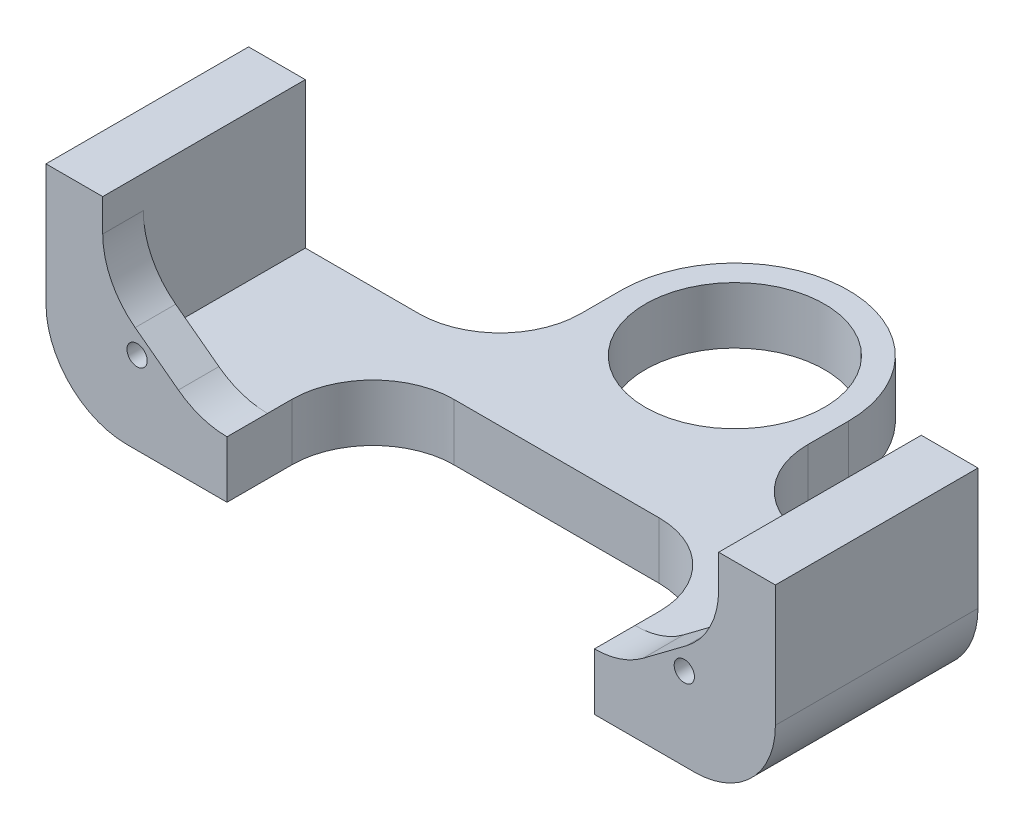
ISO-10303-21;
HEADER;
FILE_DESCRIPTION(('STEP AP214'),'2;1');
FILE_NAME('part.step','',(''),(''),'','','');
FILE_SCHEMA(('AUTOMOTIVE_DESIGN { 1 0 10303 214 1 1 1 1 }'));
ENDSEC;
DATA;
#1=APPLICATION_CONTEXT('core data for automotive mechanical design processes');
#2=APPLICATION_PROTOCOL_DEFINITION('international standard','automotive_design',2000,#1);
#3=PRODUCT_CONTEXT('',#1,'mechanical');
#4=PRODUCT('Part','Part','',(#3));
#5=PRODUCT_RELATED_PRODUCT_CATEGORY('part','',(#4));
#6=PRODUCT_DEFINITION_FORMATION('','',#4);
#7=PRODUCT_DEFINITION_CONTEXT('part definition',#1,'design');
#8=PRODUCT_DEFINITION('design','',#6,#7);
#9=PRODUCT_DEFINITION_SHAPE('','',#8);
#10=(LENGTH_UNIT() NAMED_UNIT(*) SI_UNIT(.MILLI.,.METRE.));
#11=(NAMED_UNIT(*) PLANE_ANGLE_UNIT() SI_UNIT($,.RADIAN.));
#12=(NAMED_UNIT(*) SI_UNIT($,.STERADIAN.) SOLID_ANGLE_UNIT());
#13=UNCERTAINTY_MEASURE_WITH_UNIT(LENGTH_MEASURE(1.E-05),#10,'distance_accuracy_value','');
#14=(GEOMETRIC_REPRESENTATION_CONTEXT(3) GLOBAL_UNCERTAINTY_ASSIGNED_CONTEXT((#13)) GLOBAL_UNIT_ASSIGNED_CONTEXT((#10,
#11,#12)) REPRESENTATION_CONTEXT('',''));
#15=CARTESIAN_POINT('',(0.,0.,0.));
#16=DIRECTION('',(0.,0.,1.));
#17=DIRECTION('',(1.,0.,0.));
#18=AXIS2_PLACEMENT_3D('',#15,#16,#17);
#19=CARTESIAN_POINT('',(0.,7.,40.));
#20=DIRECTION('',(0.,0.,-1.));
#21=DIRECTION('',(-1.,0.,0.));
#22=AXIS2_PLACEMENT_3D('',#19,#20,#21);
#23=PLANE('',#22);
#24=CARTESIAN_POINT('',(-19.76,10.18,40.));
#25=DIRECTION('',(0.,0.,-1.));
#26=DIRECTION('',(-1.,0.,0.));
#27=AXIS2_PLACEMENT_3D('',#24,#25,#26);
#28=CIRCLE('',#27,1.25);
#29=CARTESIAN_POINT('',(-21.01,10.18,40.));
#30=VERTEX_POINT('',#29);
#31=EDGE_CURVE('E357',#30,#30,#28,.T.);
#32=ORIENTED_EDGE('',*,*,#31,.T.);
#33=EDGE_LOOP('',(#32));
#34=FACE_BOUND('',#33,.T.);
#35=DIRECTION('',(1.,0.,0.));
#36=VECTOR('',#35,1.);
#37=CARTESIAN_POINT('',(0.,0.,40.));
#38=LINE('',#37,#36);
#39=CARTESIAN_POINT('',(-21.,0.,40.));
#40=VERTEX_POINT('',#39);
#41=CARTESIAN_POINT('',(-8.66666666666666,0.,40.));
#42=VERTEX_POINT('',#41);
#43=EDGE_CURVE('E252',#40,#42,#38,.T.);
#44=ORIENTED_EDGE('',*,*,#43,.T.);
#45=DIRECTION('',(0.,1.,0.));
#46=VECTOR('',#45,1.);
#47=CARTESIAN_POINT('',(-8.66666666666666,-48.7761325969076,40.));
#48=LINE('',#47,#46);
#49=CARTESIAN_POINT('',(-8.66666666666666,7.,40.));
#50=VERTEX_POINT('',#49);
#51=EDGE_CURVE('E235',#42,#50,#48,.T.);
#52=ORIENTED_EDGE('',*,*,#51,.T.);
#53=CARTESIAN_POINT('',(-8.66666666666666,17.,40.));
#54=DIRECTION('',(0.,0.,-1.));
#55=DIRECTION('',(-1.,0.,0.));
#56=AXIS2_PLACEMENT_3D('',#53,#54,#55);
#57=CIRCLE('',#56,10.);
#58=CARTESIAN_POINT('',(-14.6666666666667,9.,40.));
#59=VERTEX_POINT('',#58);
#60=EDGE_CURVE('E249',#50,#59,#57,.T.);
#61=ORIENTED_EDGE('',*,*,#60,.T.);
#62=DIRECTION('',(0.8,-0.6,0.));
#63=VECTOR('',#62,1.);
#64=CARTESIAN_POINT('',(16.96,-14.72,40.));
#65=LINE('',#64,#63);
#66=CARTESIAN_POINT('',(-20.,13.,40.));
#67=VERTEX_POINT('',#66);
#68=EDGE_CURVE('E363',#67,#59,#65,.T.);
#69=ORIENTED_EDGE('',*,*,#68,.F.);
#70=CARTESIAN_POINT('',(-14.,21.,40.));
#71=DIRECTION('',(0.,0.,-1.));
#72=DIRECTION('',(-1.,0.,0.));
#73=AXIS2_PLACEMENT_3D('',#70,#71,#72);
#74=CIRCLE('',#73,10.);
#75=CARTESIAN_POINT('',(-24.,21.,40.));
#76=VERTEX_POINT('',#75);
#77=EDGE_CURVE('E560',#67,#76,#74,.T.);
#78=ORIENTED_EDGE('',*,*,#77,.T.);
#79=DIRECTION('',(0.,1.,0.));
#80=VECTOR('',#79,1.);
#81=CARTESIAN_POINT('',(-24.,0.,40.));
#82=LINE('',#81,#80);
#83=CARTESIAN_POINT('',(-24.,25.,40.));
#84=VERTEX_POINT('',#83);
#85=EDGE_CURVE('E371',#76,#84,#82,.T.);
#86=ORIENTED_EDGE('',*,*,#85,.T.);
#87=DIRECTION('',(1.,0.,0.));
#88=VECTOR('',#87,1.);
#89=CARTESIAN_POINT('',(28.,25.,40.));
#90=LINE('',#89,#88);
#91=CARTESIAN_POINT('',(-31.,25.,40.));
#92=VERTEX_POINT('',#91);
#93=EDGE_CURVE('E374',#92,#84,#90,.T.);
#94=ORIENTED_EDGE('',*,*,#93,.F.);
#95=DIRECTION('',(0.,1.,0.));
#96=VECTOR('',#95,1.);
#97=CARTESIAN_POINT('',(-31.,0.,40.));
#98=LINE('',#97,#96);
#99=CARTESIAN_POINT('',(-31.,10.,40.));
#100=VERTEX_POINT('',#99);
#101=EDGE_CURVE('E378',#100,#92,#98,.T.);
#102=ORIENTED_EDGE('',*,*,#101,.F.);
#103=CARTESIAN_POINT('',(-21.,10.,40.));
#104=DIRECTION('',(0.,0.,-1.));
#105=DIRECTION('',(-1.,0.,0.));
#106=AXIS2_PLACEMENT_3D('',#103,#104,#105);
#107=CIRCLE('',#106,10.);
#108=EDGE_CURVE('E527',#100,#40,#107,.F.);
#109=ORIENTED_EDGE('',*,*,#108,.T.);
#110=EDGE_LOOP('',(#44,#52,#61,#69,#78,#86,#94,#102,#109));
#111=FACE_BOUND('',#110,.T.);
#112=ADVANCED_FACE('F41',(#34,#111),#23,.F.);
#113=CARTESIAN_POINT('',(0.,7.,0.));
#114=DIRECTION('',(1.,0.,0.));
#115=DIRECTION('',(0.,0.,-1.));
#116=AXIS2_PLACEMENT_3D('',#113,#114,#115);
#117=PLANE('',#116);
#118=DIRECTION('',(0.,0.,1.));
#119=VECTOR('',#118,1.);
#120=CARTESIAN_POINT('',(0.,0.,0.));
#121=LINE('',#120,#119);
#122=CARTESIAN_POINT('',(0.,0.,0.));
#123=VERTEX_POINT('',#122);
#124=CARTESIAN_POINT('',(0.,0.,5.00000000000002));
#125=VERTEX_POINT('',#124);
#126=EDGE_CURVE('E475',#123,#125,#121,.T.);
#127=ORIENTED_EDGE('',*,*,#126,.T.);
#128=DIRECTION('',(0.,1.,0.));
#129=VECTOR('',#128,1.);
#130=CARTESIAN_POINT('',(0.,7.,5.00000000000002));
#131=LINE('',#130,#129);
#132=CARTESIAN_POINT('',(0.,7.,5.00000000000002));
#133=VERTEX_POINT('',#132);
#134=EDGE_CURVE('E556',#125,#133,#131,.T.);
#135=ORIENTED_EDGE('',*,*,#134,.T.);
#136=DIRECTION('',(0.,0.,1.));
#137=VECTOR('',#136,1.);
#138=CARTESIAN_POINT('',(0.,7.,0.));
#139=LINE('',#138,#137);
#140=CARTESIAN_POINT('',(0.,7.,0.));
#141=VERTEX_POINT('',#140);
#142=EDGE_CURVE('E463',#141,#133,#139,.T.);
#143=ORIENTED_EDGE('',*,*,#142,.F.);
#144=DIRECTION('',(0.,-1.,0.));
#145=VECTOR('',#144,1.);
#146=CARTESIAN_POINT('',(0.,7.,0.));
#147=LINE('',#146,#145);
#148=EDGE_CURVE('E487',#141,#123,#147,.T.);
#149=ORIENTED_EDGE('',*,*,#148,.T.);
#150=EDGE_LOOP('',(#127,#135,#143,#149));
#151=FACE_BOUND('',#150,.T.);
#152=ADVANCED_FACE('F623',(#151),#117,.F.);
#153=CARTESIAN_POINT('',(0.,0.,35.));
#154=DIRECTION('',(0.,0.,1.));
#155=DIRECTION('',(1.,0.,0.));
#156=AXIS2_PLACEMENT_3D('',#153,#154,#155);
#157=PLANE('',#156);
#158=CARTESIAN_POINT('',(47.76,10.18,35.));
#159=DIRECTION('',(0.,0.,1.));
#160=DIRECTION('',(1.,0.,0.));
#161=AXIS2_PLACEMENT_3D('',#158,#159,#160);
#162=CIRCLE('',#161,1.25);
#163=CARTESIAN_POINT('',(49.01,10.18,35.));
#164=VERTEX_POINT('',#163);
#165=EDGE_CURVE('E417',#164,#164,#162,.T.);
#166=ORIENTED_EDGE('',*,*,#165,.T.);
#167=EDGE_LOOP('',(#166));
#168=FACE_BOUND('',#167,.T.);
#169=DIRECTION('',(1.,0.,0.));
#170=VECTOR('',#169,1.);
#171=CARTESIAN_POINT('',(0.,6.99999999999999,35.));
#172=LINE('',#171,#170);
#173=CARTESIAN_POINT('',(36.6666666666667,7.,35.));
#174=VERTEX_POINT('',#173);
#175=CARTESIAN_POINT('',(52.,6.99999999999999,35.));
#176=VERTEX_POINT('',#175);
#177=EDGE_CURVE('E491',#174,#176,#172,.T.);
#178=ORIENTED_EDGE('',*,*,#177,.F.);
#179=CARTESIAN_POINT('',(36.6666666666667,17.,35.));
#180=DIRECTION('',(0.,0.,1.));
#181=DIRECTION('',(1.,0.,0.));
#182=AXIS2_PLACEMENT_3D('',#179,#180,#181);
#183=CIRCLE('',#182,10.);
#184=CARTESIAN_POINT('',(42.6666666666667,9.,35.));
#185=VERTEX_POINT('',#184);
#186=EDGE_CURVE('E262',#174,#185,#183,.T.);
#187=ORIENTED_EDGE('',*,*,#186,.T.);
#188=DIRECTION('',(-0.8,-0.6,0.));
#189=VECTOR('',#188,1.);
#190=CARTESIAN_POINT('',(11.04,-14.72,35.));
#191=LINE('',#190,#189);
#192=CARTESIAN_POINT('',(48.,13.,35.));
#193=VERTEX_POINT('',#192);
#194=EDGE_CURVE('E421',#193,#185,#191,.T.);
#195=ORIENTED_EDGE('',*,*,#194,.F.);
#196=CARTESIAN_POINT('',(42.,21.,35.));
#197=DIRECTION('',(0.,0.,1.));
#198=DIRECTION('',(1.,0.,0.));
#199=AXIS2_PLACEMENT_3D('',#196,#197,#198);
#200=CIRCLE('',#199,10.);
#201=CARTESIAN_POINT('',(52.,21.,35.));
#202=VERTEX_POINT('',#201);
#203=EDGE_CURVE('E569',#193,#202,#200,.T.);
#204=ORIENTED_EDGE('',*,*,#203,.T.);
#205=DIRECTION('',(0.,1.,0.));
#206=VECTOR('',#205,1.);
#207=CARTESIAN_POINT('',(52.,16.,35.));
#208=LINE('',#207,#206);
#209=EDGE_CURVE('E387',#176,#202,#208,.T.);
#210=ORIENTED_EDGE('',*,*,#209,.F.);
#211=EDGE_LOOP('',(#178,#187,#195,#204,#210));
#212=FACE_BOUND('',#211,.T.);
#213=ADVANCED_FACE('F592',(#168,#212),#157,.F.);
#214=CARTESIAN_POINT('',(28.,7.,0.));
#215=DIRECTION('',(-1.,0.,0.));
#216=DIRECTION('',(0.,0.,1.));
#217=AXIS2_PLACEMENT_3D('',#214,#215,#216);
#218=PLANE('',#217);
#219=DIRECTION('',(0.,0.,-1.));
#220=VECTOR('',#219,1.);
#221=CARTESIAN_POINT('',(28.,7.,0.));
#222=LINE('',#221,#220);
#223=CARTESIAN_POINT('',(28.,7.,5.));
#224=VERTEX_POINT('',#223);
#225=CARTESIAN_POINT('',(28.,7.,0.));
#226=VERTEX_POINT('',#225);
#227=EDGE_CURVE('E468',#224,#226,#222,.T.);
#228=ORIENTED_EDGE('',*,*,#227,.F.);
#229=DIRECTION('',(0.,1.,0.));
#230=VECTOR('',#229,1.);
#231=CARTESIAN_POINT('',(28.,7.,5.));
#232=LINE('',#231,#230);
#233=CARTESIAN_POINT('',(28.,0.,5.));
#234=VERTEX_POINT('',#233);
#235=EDGE_CURVE('E553',#224,#234,#232,.F.);
#236=ORIENTED_EDGE('',*,*,#235,.T.);
#237=DIRECTION('',(0.,0.,-1.));
#238=VECTOR('',#237,1.);
#239=CARTESIAN_POINT('',(28.,0.,0.));
#240=LINE('',#239,#238);
#241=CARTESIAN_POINT('',(28.,0.,0.));
#242=VERTEX_POINT('',#241);
#243=EDGE_CURVE('E464',#234,#242,#240,.T.);
#244=ORIENTED_EDGE('',*,*,#243,.T.);
#245=DIRECTION('',(0.,-1.,0.));
#246=VECTOR('',#245,1.);
#247=CARTESIAN_POINT('',(28.,7.,0.));
#248=LINE('',#247,#246);
#249=EDGE_CURVE('E471',#226,#242,#248,.T.);
#250=ORIENTED_EDGE('',*,*,#249,.F.);
#251=EDGE_LOOP('',(#228,#236,#244,#250));
#252=FACE_BOUND('',#251,.T.);
#253=ADVANCED_FACE('F612',(#252),#218,.F.);
#254=CARTESIAN_POINT('',(14.,7.,0.));
#255=DIRECTION('',(0.,1.,0.));
#256=DIRECTION('',(0.,0.,1.));
#257=AXIS2_PLACEMENT_3D('',#254,#255,#256);
#258=PLANE('',#257);
#259=DIRECTION('',(0.,0.,1.));
#260=VECTOR('',#259,1.);
#261=CARTESIAN_POINT('',(-8.66666666666666,7.,22.));
#262=LINE('',#261,#260);
#263=CARTESIAN_POINT('',(-8.66666666666666,7.,32.));
#264=VERTEX_POINT('',#263);
#265=CARTESIAN_POINT('',(-8.66666666666666,7.,35.));
#266=VERTEX_POINT('',#265);
#267=EDGE_CURVE('E237',#264,#266,#262,.T.);
#268=ORIENTED_EDGE('',*,*,#267,.F.);
#269=CARTESIAN_POINT('',(1.33333333333334,7.,32.));
#270=DIRECTION('',(0.,1.,0.));
#271=DIRECTION('',(0.,0.,1.));
#272=AXIS2_PLACEMENT_3D('',#269,#270,#271);
#273=CIRCLE('',#272,10.);
#274=CARTESIAN_POINT('',(1.33333333333334,7.,22.));
#275=VERTEX_POINT('',#274);
#276=EDGE_CURVE('E50',#264,#275,#273,.F.);
#277=ORIENTED_EDGE('',*,*,#276,.T.);
#278=DIRECTION('',(-1.,0.,0.));
#279=VECTOR('',#278,1.);
#280=CARTESIAN_POINT('',(-8.66666666666666,7.,22.));
#281=LINE('',#280,#279);
#282=CARTESIAN_POINT('',(26.6666666666667,7.,22.));
#283=VERTEX_POINT('',#282);
#284=EDGE_CURVE('E255',#283,#275,#281,.T.);
#285=ORIENTED_EDGE('',*,*,#284,.F.);
#286=CARTESIAN_POINT('',(26.6666666666667,7.,32.));
#287=DIRECTION('',(0.,1.,0.));
#288=DIRECTION('',(0.,0.,1.));
#289=AXIS2_PLACEMENT_3D('',#286,#287,#288);
#290=CIRCLE('',#289,10.);
#291=CARTESIAN_POINT('',(36.6666666666667,7.,32.));
#292=VERTEX_POINT('',#291);
#293=EDGE_CURVE('E297',#283,#292,#290,.F.);
#294=ORIENTED_EDGE('',*,*,#293,.T.);
#295=DIRECTION('',(0.,0.,-1.));
#296=VECTOR('',#295,1.);
#297=CARTESIAN_POINT('',(36.6666666666667,7.,22.));
#298=LINE('',#297,#296);
#299=EDGE_CURVE('E313',#174,#292,#298,.T.);
#300=ORIENTED_EDGE('',*,*,#299,.F.);
#301=ORIENTED_EDGE('',*,*,#177,.T.);
#302=DIRECTION('',(0.,0.,1.));
#303=VECTOR('',#302,1.);
#304=CARTESIAN_POINT('',(52.,6.99999999999999,15.));
#305=LINE('',#304,#303);
#306=CARTESIAN_POINT('',(52.,6.99999999999999,15.));
#307=VERTEX_POINT('',#306);
#308=EDGE_CURVE('E410',#307,#176,#305,.T.);
#309=ORIENTED_EDGE('',*,*,#308,.F.);
#310=DIRECTION('',(1.,0.,0.));
#311=VECTOR('',#310,1.);
#312=CARTESIAN_POINT('',(28.,7.,15.));
#313=LINE('',#312,#311);
#314=CARTESIAN_POINT('',(38.,6.99999999999999,15.));
#315=VERTEX_POINT('',#314);
#316=EDGE_CURVE('E407',#315,#307,#313,.T.);
#317=ORIENTED_EDGE('',*,*,#316,.F.);
#318=CARTESIAN_POINT('',(38.,7.,5.));
#319=DIRECTION('',(0.,1.,0.));
#320=DIRECTION('',(0.,0.,1.));
#321=AXIS2_PLACEMENT_3D('',#318,#319,#320);
#322=CIRCLE('',#321,10.);
#323=EDGE_CURVE('E267',#315,#224,#322,.F.);
#324=ORIENTED_EDGE('',*,*,#323,.T.);
#325=ORIENTED_EDGE('',*,*,#227,.T.);
#326=CARTESIAN_POINT('',(14.,7.,0.));
#327=DIRECTION('',(0.,1.,0.));
#328=DIRECTION('',(0.,0.,1.));
#329=AXIS2_PLACEMENT_3D('',#326,#327,#328);
#330=CIRCLE('',#329,14.);
#331=EDGE_CURVE('E459',#226,#141,#330,.T.);
#332=ORIENTED_EDGE('',*,*,#331,.T.);
#333=ORIENTED_EDGE('',*,*,#142,.T.);
#334=CARTESIAN_POINT('',(-10.,7.,5.00000000000002));
#335=DIRECTION('',(0.,1.,0.));
#336=DIRECTION('',(0.,0.,1.));
#337=AXIS2_PLACEMENT_3D('',#334,#335,#336);
#338=CIRCLE('',#337,10.);
#339=CARTESIAN_POINT('',(-9.99999999999999,6.99999999999999,15.));
#340=VERTEX_POINT('',#339);
#341=EDGE_CURVE('E278',#133,#340,#338,.F.);
#342=ORIENTED_EDGE('',*,*,#341,.T.);
#343=DIRECTION('',(-1.,0.,0.));
#344=VECTOR('',#343,1.);
#345=CARTESIAN_POINT('',(-24.,6.99999999999999,15.));
#346=LINE('',#345,#344);
#347=CARTESIAN_POINT('',(-24.,6.99999999999999,15.));
#348=VERTEX_POINT('',#347);
#349=EDGE_CURVE('E338',#340,#348,#346,.T.);
#350=ORIENTED_EDGE('',*,*,#349,.T.);
#351=DIRECTION('',(0.,0.,1.));
#352=VECTOR('',#351,1.);
#353=CARTESIAN_POINT('',(-24.,6.99999999999999,15.));
#354=LINE('',#353,#352);
#355=CARTESIAN_POINT('',(-24.,6.99999999999999,35.));
#356=VERTEX_POINT('',#355);
#357=EDGE_CURVE('E352',#348,#356,#354,.T.);
#358=ORIENTED_EDGE('',*,*,#357,.T.);
#359=DIRECTION('',(-1.,0.,0.));
#360=VECTOR('',#359,1.);
#361=CARTESIAN_POINT('',(28.,7.00000000000001,35.));
#362=LINE('',#361,#360);
#363=EDGE_CURVE('E495',#266,#356,#362,.T.);
#364=ORIENTED_EDGE('',*,*,#363,.F.);
#365=EDGE_LOOP('',(#268,#277,#285,#294,#300,#301,#309,#317,#324,#325,#332,#333,#342,#350,#358,#364));
#366=FACE_BOUND('',#365,.T.);
#367=CARTESIAN_POINT('',(14.,7.,0.));
#368=DIRECTION('',(0.,1.,0.));
#369=DIRECTION('',(0.,0.,1.));
#370=AXIS2_PLACEMENT_3D('',#367,#368,#369);
#371=CIRCLE('',#370,11.05);
#372=CARTESIAN_POINT('',(14.,7.,11.05));
#373=VERTEX_POINT('',#372);
#374=EDGE_CURVE('E451',#373,#373,#371,.T.);
#375=ORIENTED_EDGE('',*,*,#374,.F.);
#376=EDGE_LOOP('',(#375));
#377=FACE_BOUND('',#376,.T.);
#378=ADVANCED_FACE('F306',(#366,#377),#258,.T.);
#379=CARTESIAN_POINT('',(14.,0.,0.));
#380=DIRECTION('',(0.,1.,0.));
#381=DIRECTION('',(0.,0.,1.));
#382=AXIS2_PLACEMENT_3D('',#379,#380,#381);
#383=PLANE('',#382);
#384=DIRECTION('',(1.,0.,0.));
#385=VECTOR('',#384,1.);
#386=CARTESIAN_POINT('',(-8.66666666666666,0.,22.));
#387=LINE('',#386,#385);
#388=CARTESIAN_POINT('',(1.33333333333334,0.,22.));
#389=VERTEX_POINT('',#388);
#390=CARTESIAN_POINT('',(26.6666666666667,0.,22.));
#391=VERTEX_POINT('',#390);
#392=EDGE_CURVE('E318',#389,#391,#387,.T.);
#393=ORIENTED_EDGE('',*,*,#392,.F.);
#394=CARTESIAN_POINT('',(1.33333333333334,0.,32.));
#395=DIRECTION('',(0.,1.,0.));
#396=DIRECTION('',(0.,0.,1.));
#397=AXIS2_PLACEMENT_3D('',#394,#395,#396);
#398=CIRCLE('',#397,10.);
#399=CARTESIAN_POINT('',(-8.66666666666666,0.,32.));
#400=VERTEX_POINT('',#399);
#401=EDGE_CURVE('E11',#389,#400,#398,.T.);
#402=ORIENTED_EDGE('',*,*,#401,.T.);
#403=DIRECTION('',(0.,0.,-1.));
#404=VECTOR('',#403,1.);
#405=CARTESIAN_POINT('',(-8.66666666666666,0.,22.));
#406=LINE('',#405,#404);
#407=EDGE_CURVE('E315',#42,#400,#406,.T.);
#408=ORIENTED_EDGE('',*,*,#407,.F.);
#409=ORIENTED_EDGE('',*,*,#43,.F.);
#410=DIRECTION('',(0.,0.,1.));
#411=VECTOR('',#410,1.);
#412=CARTESIAN_POINT('',(-21.,0.,0.));
#413=LINE('',#412,#411);
#414=CARTESIAN_POINT('',(-21.,0.,15.));
#415=VERTEX_POINT('',#414);
#416=EDGE_CURVE('E534',#40,#415,#413,.F.);
#417=ORIENTED_EDGE('',*,*,#416,.T.);
#418=DIRECTION('',(1.,0.,0.));
#419=VECTOR('',#418,1.);
#420=CARTESIAN_POINT('',(-31.,0.,15.));
#421=LINE('',#420,#419);
#422=CARTESIAN_POINT('',(-9.99999999999999,0.,15.));
#423=VERTEX_POINT('',#422);
#424=EDGE_CURVE('E341',#415,#423,#421,.T.);
#425=ORIENTED_EDGE('',*,*,#424,.T.);
#426=CARTESIAN_POINT('',(-10.,0.,5.00000000000002));
#427=DIRECTION('',(0.,1.,0.));
#428=DIRECTION('',(0.,0.,1.));
#429=AXIS2_PLACEMENT_3D('',#426,#427,#428);
#430=CIRCLE('',#429,10.);
#431=EDGE_CURVE('E281',#423,#125,#430,.T.);
#432=ORIENTED_EDGE('',*,*,#431,.T.);
#433=ORIENTED_EDGE('',*,*,#126,.F.);
#434=CARTESIAN_POINT('',(14.,0.,0.));
#435=DIRECTION('',(0.,1.,0.));
#436=DIRECTION('',(0.,0.,1.));
#437=AXIS2_PLACEMENT_3D('',#434,#435,#436);
#438=CIRCLE('',#437,14.);
#439=EDGE_CURVE('E455',#242,#123,#438,.T.);
#440=ORIENTED_EDGE('',*,*,#439,.F.);
#441=ORIENTED_EDGE('',*,*,#243,.F.);
#442=CARTESIAN_POINT('',(38.,0.,5.));
#443=DIRECTION('',(0.,1.,0.));
#444=DIRECTION('',(0.,0.,1.));
#445=AXIS2_PLACEMENT_3D('',#442,#443,#444);
#446=CIRCLE('',#445,10.);
#447=CARTESIAN_POINT('',(38.,0.,15.));
#448=VERTEX_POINT('',#447);
#449=EDGE_CURVE('E275',#234,#448,#446,.T.);
#450=ORIENTED_EDGE('',*,*,#449,.T.);
#451=DIRECTION('',(-1.,0.,0.));
#452=VECTOR('',#451,1.);
#453=CARTESIAN_POINT('',(59.,0.,15.));
#454=LINE('',#453,#452);
#455=CARTESIAN_POINT('',(49.,0.,15.));
#456=VERTEX_POINT('',#455);
#457=EDGE_CURVE('E403',#456,#448,#454,.T.);
#458=ORIENTED_EDGE('',*,*,#457,.F.);
#459=DIRECTION('',(0.,0.,1.));
#460=VECTOR('',#459,1.);
#461=CARTESIAN_POINT('',(49.,0.,40.));
#462=LINE('',#461,#460);
#463=CARTESIAN_POINT('',(49.,0.,40.));
#464=VERTEX_POINT('',#463);
#465=EDGE_CURVE('E530',#456,#464,#462,.T.);
#466=ORIENTED_EDGE('',*,*,#465,.T.);
#467=CARTESIAN_POINT('',(36.6666666666667,0.,40.));
#468=VERTEX_POINT('',#467);
#469=EDGE_CURVE('E479',#468,#464,#38,.T.);
#470=ORIENTED_EDGE('',*,*,#469,.F.);
#471=DIRECTION('',(0.,0.,1.));
#472=VECTOR('',#471,1.);
#473=CARTESIAN_POINT('',(36.6666666666667,0.,22.));
#474=LINE('',#473,#472);
#475=CARTESIAN_POINT('',(36.6666666666667,0.,32.));
#476=VERTEX_POINT('',#475);
#477=EDGE_CURVE('E324',#476,#468,#474,.T.);
#478=ORIENTED_EDGE('',*,*,#477,.F.);
#479=CARTESIAN_POINT('',(26.6666666666667,0.,32.));
#480=DIRECTION('',(0.,1.,0.));
#481=DIRECTION('',(0.,0.,1.));
#482=AXIS2_PLACEMENT_3D('',#479,#480,#481);
#483=CIRCLE('',#482,10.);
#484=EDGE_CURVE('E300',#476,#391,#483,.T.);
#485=ORIENTED_EDGE('',*,*,#484,.T.);
#486=EDGE_LOOP('',(#393,#402,#408,#409,#417,#425,#432,#433,#440,#441,#450,#458,#466,#470,#478,#485));
#487=FACE_BOUND('',#486,.T.);
#488=CARTESIAN_POINT('',(14.,0.,0.));
#489=DIRECTION('',(0.,1.,0.));
#490=DIRECTION('',(0.,0.,1.));
#491=AXIS2_PLACEMENT_3D('',#488,#489,#490);
#492=CIRCLE('',#491,11.05);
#493=CARTESIAN_POINT('',(14.,0.,11.05));
#494=VERTEX_POINT('',#493);
#495=EDGE_CURVE('E447',#494,#494,#492,.T.);
#496=ORIENTED_EDGE('',*,*,#495,.T.);
#497=EDGE_LOOP('',(#496));
#498=FACE_BOUND('',#497,.T.);
#499=ADVANCED_FACE('F615',(#487,#498),#383,.F.);
#500=CARTESIAN_POINT('',(14.,7.,0.));
#501=DIRECTION('',(0.,-1.,0.));
#502=DIRECTION('',(0.,0.,-1.));
#503=AXIS2_PLACEMENT_3D('',#500,#501,#502);
#504=CYLINDRICAL_SURFACE('',#503,14.);
#505=ORIENTED_EDGE('',*,*,#439,.T.);
#506=ORIENTED_EDGE('',*,*,#148,.F.);
#507=ORIENTED_EDGE('',*,*,#331,.F.);
#508=ORIENTED_EDGE('',*,*,#249,.T.);
#509=EDGE_LOOP('',(#505,#506,#507,#508));
#510=FACE_BOUND('',#509,.T.);
#511=ADVANCED_FACE('F619',(#510),#504,.T.);
#512=CARTESIAN_POINT('',(36.6666666666667,17.,40.));
#513=DIRECTION('',(0.,0.,-1.));
#514=DIRECTION('',(-1.,0.,0.));
#515=AXIS2_PLACEMENT_3D('',#512,#513,#514);
#516=CIRCLE('',#515,10.);
#517=CARTESIAN_POINT('',(42.6666666666667,9.,40.));
#518=VERTEX_POINT('',#517);
#519=CARTESIAN_POINT('',(36.6666666666667,7.,40.));
#520=VERTEX_POINT('',#519);
#521=EDGE_CURVE('E269',#518,#520,#516,.T.);
#522=ORIENTED_EDGE('',*,*,#521,.T.);
#523=DIRECTION('',(0.,1.,0.));
#524=VECTOR('',#523,1.);
#525=CARTESIAN_POINT('',(36.6666666666667,-48.7761325969076,40.));
#526=LINE('',#525,#524);
#527=EDGE_CURVE('E254',#468,#520,#526,.T.);
#528=ORIENTED_EDGE('',*,*,#527,.F.);
#529=ORIENTED_EDGE('',*,*,#469,.T.);
#530=CARTESIAN_POINT('',(49.,10.,40.));
#531=DIRECTION('',(0.,0.,-1.));
#532=DIRECTION('',(-1.,0.,0.));
#533=AXIS2_PLACEMENT_3D('',#530,#531,#532);
#534=CIRCLE('',#533,10.);
#535=CARTESIAN_POINT('',(59.,10.,40.));
#536=VERTEX_POINT('',#535);
#537=EDGE_CURVE('E524',#464,#536,#534,.F.);
#538=ORIENTED_EDGE('',*,*,#537,.T.);
#539=DIRECTION('',(0.,1.,0.));
#540=VECTOR('',#539,1.);
#541=CARTESIAN_POINT('',(59.,0.,40.));
#542=LINE('',#541,#540);
#543=CARTESIAN_POINT('',(59.,25.,40.));
#544=VERTEX_POINT('',#543);
#545=EDGE_CURVE('E437',#536,#544,#542,.T.);
#546=ORIENTED_EDGE('',*,*,#545,.T.);
#547=DIRECTION('',(-1.,0.,0.));
#548=VECTOR('',#547,1.);
#549=CARTESIAN_POINT('',(0.,25.,40.));
#550=LINE('',#549,#548);
#551=CARTESIAN_POINT('',(52.,25.,40.));
#552=VERTEX_POINT('',#551);
#553=EDGE_CURVE('E422',#544,#552,#550,.T.);
#554=ORIENTED_EDGE('',*,*,#553,.T.);
#555=DIRECTION('',(0.,1.,0.));
#556=VECTOR('',#555,1.);
#557=CARTESIAN_POINT('',(52.,0.,40.));
#558=LINE('',#557,#556);
#559=CARTESIAN_POINT('',(52.,21.,40.));
#560=VERTEX_POINT('',#559);
#561=EDGE_CURVE('E430',#560,#552,#558,.T.);
#562=ORIENTED_EDGE('',*,*,#561,.F.);
#563=CARTESIAN_POINT('',(42.,21.,40.));
#564=DIRECTION('',(0.,0.,-1.));
#565=DIRECTION('',(-1.,0.,0.));
#566=AXIS2_PLACEMENT_3D('',#563,#564,#565);
#567=CIRCLE('',#566,10.);
#568=CARTESIAN_POINT('',(48.,13.,40.));
#569=VERTEX_POINT('',#568);
#570=EDGE_CURVE('E566',#560,#569,#567,.T.);
#571=ORIENTED_EDGE('',*,*,#570,.T.);
#572=DIRECTION('',(-0.8,-0.6,0.));
#573=VECTOR('',#572,1.);
#574=CARTESIAN_POINT('',(11.04,-14.72,40.));
#575=LINE('',#574,#573);
#576=EDGE_CURVE('E433',#569,#518,#575,.T.);
#577=ORIENTED_EDGE('',*,*,#576,.T.);
#578=EDGE_LOOP('',(#522,#528,#529,#538,#546,#554,#562,#571,#577));
#579=FACE_BOUND('',#578,.T.);
#580=CARTESIAN_POINT('',(47.76,10.18,40.));
#581=DIRECTION('',(0.,0.,1.));
#582=DIRECTION('',(1.,0.,0.));
#583=AXIS2_PLACEMENT_3D('',#580,#581,#582);
#584=CIRCLE('',#583,1.25);
#585=CARTESIAN_POINT('',(49.01,10.18,40.));
#586=VERTEX_POINT('',#585);
#587=EDGE_CURVE('E416',#586,#586,#584,.T.);
#588=ORIENTED_EDGE('',*,*,#587,.F.);
#589=EDGE_LOOP('',(#588));
#590=FACE_BOUND('',#589,.T.);
#591=ADVANCED_FACE('F577',(#579,#590),#23,.F.);
#592=CARTESIAN_POINT('',(14.,7.,0.));
#593=DIRECTION('',(0.,-1.,0.));
#594=DIRECTION('',(0.,0.,-1.));
#595=AXIS2_PLACEMENT_3D('',#592,#593,#594);
#596=CYLINDRICAL_SURFACE('',#595,11.05);
#597=ORIENTED_EDGE('',*,*,#374,.T.);
#598=EDGE_LOOP('',(#597));
#599=FACE_BOUND('',#598,.T.);
#600=ORIENTED_EDGE('',*,*,#495,.F.);
#601=EDGE_LOOP('',(#600));
#602=FACE_BOUND('',#601,.T.);
#603=ADVANCED_FACE('F681',(#599,#602),#596,.F.);
#604=CARTESIAN_POINT('',(52.,0.,35.));
#605=DIRECTION('',(1.,0.,0.));
#606=DIRECTION('',(0.,1.,0.));
#607=AXIS2_PLACEMENT_3D('',#604,#605,#606);
#608=PLANE('',#607);
#609=ORIENTED_EDGE('',*,*,#209,.T.);
#610=DIRECTION('',(0.,0.,1.));
#611=VECTOR('',#610,1.);
#612=CARTESIAN_POINT('',(52.,21.,35.));
#613=LINE('',#612,#611);
#614=EDGE_CURVE('E508',#202,#560,#613,.T.);
#615=ORIENTED_EDGE('',*,*,#614,.T.);
#616=ORIENTED_EDGE('',*,*,#561,.T.);
#617=DIRECTION('',(0.,0.,1.));
#618=VECTOR('',#617,1.);
#619=CARTESIAN_POINT('',(52.,25.,35.));
#620=LINE('',#619,#618);
#621=CARTESIAN_POINT('',(52.,25.,15.));
#622=VERTEX_POINT('',#621);
#623=EDGE_CURVE('E443',#622,#552,#620,.T.);
#624=ORIENTED_EDGE('',*,*,#623,.F.);
#625=DIRECTION('',(0.,1.,0.));
#626=VECTOR('',#625,1.);
#627=CARTESIAN_POINT('',(52.,16.,15.));
#628=LINE('',#627,#626);
#629=EDGE_CURVE('E391',#307,#622,#628,.T.);
#630=ORIENTED_EDGE('',*,*,#629,.F.);
#631=ORIENTED_EDGE('',*,*,#308,.T.);
#632=EDGE_LOOP('',(#609,#615,#616,#624,#630,#631));
#633=FACE_BOUND('',#632,.T.);
#634=ADVANCED_FACE('F597',(#633),#608,.F.);
#635=CARTESIAN_POINT('',(0.,25.,35.));
#636=DIRECTION('',(0.,1.,0.));
#637=DIRECTION('',(-1.,0.,0.));
#638=AXIS2_PLACEMENT_3D('',#635,#636,#637);
#639=PLANE('',#638);
#640=ORIENTED_EDGE('',*,*,#553,.F.);
#641=DIRECTION('',(0.,0.,1.));
#642=VECTOR('',#641,1.);
#643=CARTESIAN_POINT('',(59.,25.,35.));
#644=LINE('',#643,#642);
#645=CARTESIAN_POINT('',(59.,25.,15.));
#646=VERTEX_POINT('',#645);
#647=EDGE_CURVE('E426',#646,#544,#644,.T.);
#648=ORIENTED_EDGE('',*,*,#647,.F.);
#649=DIRECTION('',(1.,0.,0.));
#650=VECTOR('',#649,1.);
#651=CARTESIAN_POINT('',(52.,25.,15.));
#652=LINE('',#651,#650);
#653=EDGE_CURVE('E395',#622,#646,#652,.T.);
#654=ORIENTED_EDGE('',*,*,#653,.F.);
#655=ORIENTED_EDGE('',*,*,#623,.T.);
#656=EDGE_LOOP('',(#640,#648,#654,#655));
#657=FACE_BOUND('',#656,.T.);
#658=ADVANCED_FACE('F707',(#657),#639,.T.);
#659=CARTESIAN_POINT('',(59.,0.,35.));
#660=DIRECTION('',(1.,0.,0.));
#661=DIRECTION('',(0.,0.,-1.));
#662=AXIS2_PLACEMENT_3D('',#659,#660,#661);
#663=PLANE('',#662);
#664=ORIENTED_EDGE('',*,*,#545,.F.);
#665=DIRECTION('',(0.,0.,1.));
#666=VECTOR('',#665,1.);
#667=CARTESIAN_POINT('',(59.,10.,15.));
#668=LINE('',#667,#666);
#669=CARTESIAN_POINT('',(59.,10.,15.));
#670=VERTEX_POINT('',#669);
#671=EDGE_CURVE('E543',#536,#670,#668,.F.);
#672=ORIENTED_EDGE('',*,*,#671,.T.);
#673=DIRECTION('',(0.,-1.,0.));
#674=VECTOR('',#673,1.);
#675=CARTESIAN_POINT('',(59.,25.,15.));
#676=LINE('',#675,#674);
#677=EDGE_CURVE('E399',#646,#670,#676,.T.);
#678=ORIENTED_EDGE('',*,*,#677,.F.);
#679=ORIENTED_EDGE('',*,*,#647,.T.);
#680=EDGE_LOOP('',(#664,#672,#678,#679));
#681=FACE_BOUND('',#680,.T.);
#682=ADVANCED_FACE('F710',(#681),#663,.T.);
#683=CARTESIAN_POINT('',(47.76,10.18,35.));
#684=DIRECTION('',(0.,0.,1.));
#685=DIRECTION('',(1.,0.,0.));
#686=AXIS2_PLACEMENT_3D('',#683,#684,#685);
#687=CYLINDRICAL_SURFACE('',#686,1.25);
#688=ORIENTED_EDGE('',*,*,#165,.F.);
#689=EDGE_LOOP('',(#688));
#690=FACE_BOUND('',#689,.T.);
#691=ORIENTED_EDGE('',*,*,#587,.T.);
#692=EDGE_LOOP('',(#691));
#693=FACE_BOUND('',#692,.T.);
#694=ADVANCED_FACE('F714',(#690,#693),#687,.F.);
#695=CARTESIAN_POINT('',(11.04,-14.72,35.));
#696=DIRECTION('',(-0.6,0.8,0.));
#697=DIRECTION('',(-0.8,-0.6,0.));
#698=AXIS2_PLACEMENT_3D('',#695,#696,#697);
#699=PLANE('',#698);
#700=ORIENTED_EDGE('',*,*,#576,.F.);
#701=DIRECTION('',(0.,0.,1.));
#702=VECTOR('',#701,1.);
#703=CARTESIAN_POINT('',(48.,13.,35.));
#704=LINE('',#703,#702);
#705=EDGE_CURVE('E244',#569,#193,#704,.F.);
#706=ORIENTED_EDGE('',*,*,#705,.T.);
#707=ORIENTED_EDGE('',*,*,#194,.T.);
#708=DIRECTION('',(0.,0.,1.));
#709=VECTOR('',#708,1.);
#710=CARTESIAN_POINT('',(42.6666666666667,9.,40.));
#711=LINE('',#710,#709);
#712=EDGE_CURVE('E512',#185,#518,#711,.T.);
#713=ORIENTED_EDGE('',*,*,#712,.T.);
#714=EDGE_LOOP('',(#700,#706,#707,#713));
#715=FACE_BOUND('',#714,.T.);
#716=ADVANCED_FACE('F716',(#715),#699,.T.);
#717=CARTESIAN_POINT('',(0.,0.,15.));
#718=DIRECTION('',(0.,0.,-1.));
#719=DIRECTION('',(-1.,0.,0.));
#720=AXIS2_PLACEMENT_3D('',#717,#718,#719);
#721=PLANE('',#720);
#722=ORIENTED_EDGE('',*,*,#677,.T.);
#723=CARTESIAN_POINT('',(49.,10.,15.));
#724=DIRECTION('',(0.,0.,-1.));
#725=DIRECTION('',(-1.,0.,0.));
#726=AXIS2_PLACEMENT_3D('',#723,#724,#725);
#727=CIRCLE('',#726,10.);
#728=EDGE_CURVE('E550',#670,#456,#727,.T.);
#729=ORIENTED_EDGE('',*,*,#728,.T.);
#730=ORIENTED_EDGE('',*,*,#457,.T.);
#731=DIRECTION('',(0.,1.,0.));
#732=VECTOR('',#731,1.);
#733=CARTESIAN_POINT('',(38.,0.,15.));
#734=LINE('',#733,#732);
#735=EDGE_CURVE('E546',#448,#315,#734,.T.);
#736=ORIENTED_EDGE('',*,*,#735,.T.);
#737=ORIENTED_EDGE('',*,*,#316,.T.);
#738=ORIENTED_EDGE('',*,*,#629,.T.);
#739=ORIENTED_EDGE('',*,*,#653,.T.);
#740=EDGE_LOOP('',(#722,#729,#730,#736,#737,#738,#739));
#741=FACE_BOUND('',#740,.T.);
#742=ADVANCED_FACE('F603',(#741),#721,.T.);
#743=CARTESIAN_POINT('',(-24.,0.,35.));
#744=DIRECTION('',(1.,0.,0.));
#745=DIRECTION('',(0.,1.,0.));
#746=AXIS2_PLACEMENT_3D('',#743,#744,#745);
#747=PLANE('',#746);
#748=ORIENTED_EDGE('',*,*,#85,.F.);
#749=DIRECTION('',(0.,0.,1.));
#750=VECTOR('',#749,1.);
#751=CARTESIAN_POINT('',(-24.,21.,35.));
#752=LINE('',#751,#750);
#753=CARTESIAN_POINT('',(-24.,21.,35.));
#754=VERTEX_POINT('',#753);
#755=EDGE_CURVE('E504',#76,#754,#752,.F.);
#756=ORIENTED_EDGE('',*,*,#755,.T.);
#757=DIRECTION('',(0.,1.,0.));
#758=VECTOR('',#757,1.);
#759=CARTESIAN_POINT('',(-24.,16.,35.));
#760=LINE('',#759,#758);
#761=EDGE_CURVE('E317',#356,#754,#760,.T.);
#762=ORIENTED_EDGE('',*,*,#761,.F.);
#763=ORIENTED_EDGE('',*,*,#357,.F.);
#764=DIRECTION('',(0.,1.,0.));
#765=VECTOR('',#764,1.);
#766=CARTESIAN_POINT('',(-24.,16.,15.));
#767=LINE('',#766,#765);
#768=CARTESIAN_POINT('',(-24.,25.,15.));
#769=VERTEX_POINT('',#768);
#770=EDGE_CURVE('E322',#348,#769,#767,.T.);
#771=ORIENTED_EDGE('',*,*,#770,.T.);
#772=DIRECTION('',(0.,0.,1.));
#773=VECTOR('',#772,1.);
#774=CARTESIAN_POINT('',(-24.,25.,35.));
#775=LINE('',#774,#773);
#776=EDGE_CURVE('E367',#769,#84,#775,.T.);
#777=ORIENTED_EDGE('',*,*,#776,.T.);
#778=EDGE_LOOP('',(#748,#756,#762,#763,#771,#777));
#779=FACE_BOUND('',#778,.T.);
#780=ADVANCED_FACE('F650',(#779),#747,.T.);
#781=CARTESIAN_POINT('',(16.96,-14.72,35.));
#782=DIRECTION('',(-0.6,-0.8,0.));
#783=DIRECTION('',(0.8,-0.6,0.));
#784=AXIS2_PLACEMENT_3D('',#781,#782,#783);
#785=PLANE('',#784);
#786=DIRECTION('',(0.8,-0.6,0.));
#787=VECTOR('',#786,1.);
#788=CARTESIAN_POINT('',(16.96,-14.72,35.));
#789=LINE('',#788,#787);
#790=CARTESIAN_POINT('',(-20.,13.,35.));
#791=VERTEX_POINT('',#790);
#792=CARTESIAN_POINT('',(-14.6666666666667,9.,35.));
#793=VERTEX_POINT('',#792);
#794=EDGE_CURVE('E362',#791,#793,#789,.T.);
#795=ORIENTED_EDGE('',*,*,#794,.F.);
#796=DIRECTION('',(0.,0.,1.));
#797=VECTOR('',#796,1.);
#798=CARTESIAN_POINT('',(-20.,13.,35.));
#799=LINE('',#798,#797);
#800=EDGE_CURVE('E500',#791,#67,#799,.T.);
#801=ORIENTED_EDGE('',*,*,#800,.T.);
#802=ORIENTED_EDGE('',*,*,#68,.T.);
#803=DIRECTION('',(0.,0.,1.));
#804=VECTOR('',#803,1.);
#805=CARTESIAN_POINT('',(-14.6666666666667,9.,35.));
#806=LINE('',#805,#804);
#807=EDGE_CURVE('E259',#59,#793,#806,.F.);
#808=ORIENTED_EDGE('',*,*,#807,.T.);
#809=EDGE_LOOP('',(#795,#801,#802,#808));
#810=FACE_BOUND('',#809,.T.);
#811=ADVANCED_FACE('F657',(#810),#785,.F.);
#812=CARTESIAN_POINT('',(-31.,0.,35.));
#813=DIRECTION('',(1.,0.,0.));
#814=DIRECTION('',(0.,0.,-1.));
#815=AXIS2_PLACEMENT_3D('',#812,#813,#814);
#816=PLANE('',#815);
#817=DIRECTION('',(0.,-1.,0.));
#818=VECTOR('',#817,1.);
#819=CARTESIAN_POINT('',(-31.,25.,15.));
#820=LINE('',#819,#818);
#821=CARTESIAN_POINT('',(-31.,25.,15.));
#822=VERTEX_POINT('',#821);
#823=CARTESIAN_POINT('',(-31.,10.,15.));
#824=VERTEX_POINT('',#823);
#825=EDGE_CURVE('E345',#822,#824,#820,.T.);
#826=ORIENTED_EDGE('',*,*,#825,.T.);
#827=DIRECTION('',(0.,0.,1.));
#828=VECTOR('',#827,1.);
#829=CARTESIAN_POINT('',(-31.,10.,35.));
#830=LINE('',#829,#828);
#831=EDGE_CURVE('E520',#824,#100,#830,.T.);
#832=ORIENTED_EDGE('',*,*,#831,.T.);
#833=ORIENTED_EDGE('',*,*,#101,.T.);
#834=DIRECTION('',(0.,0.,1.));
#835=VECTOR('',#834,1.);
#836=CARTESIAN_POINT('',(-31.,25.,35.));
#837=LINE('',#836,#835);
#838=EDGE_CURVE('E383',#822,#92,#837,.T.);
#839=ORIENTED_EDGE('',*,*,#838,.F.);
#840=EDGE_LOOP('',(#826,#832,#833,#839));
#841=FACE_BOUND('',#840,.T.);
#842=ADVANCED_FACE('F641',(#841),#816,.F.);
#843=CARTESIAN_POINT('',(-19.76,10.18,35.));
#844=DIRECTION('',(0.,0.,1.));
#845=DIRECTION('',(1.,0.,0.));
#846=AXIS2_PLACEMENT_3D('',#843,#844,#845);
#847=CYLINDRICAL_SURFACE('',#846,1.25);
#848=CARTESIAN_POINT('',(-19.76,10.18,35.));
#849=DIRECTION('',(0.,0.,-1.));
#850=DIRECTION('',(-1.,0.,0.));
#851=AXIS2_PLACEMENT_3D('',#848,#849,#850);
#852=CIRCLE('',#851,1.25);
#853=CARTESIAN_POINT('',(-21.01,10.18,35.));
#854=VERTEX_POINT('',#853);
#855=EDGE_CURVE('E358',#854,#854,#852,.T.);
#856=ORIENTED_EDGE('',*,*,#855,.T.);
#857=EDGE_LOOP('',(#856));
#858=FACE_BOUND('',#857,.T.);
#859=ORIENTED_EDGE('',*,*,#31,.F.);
#860=EDGE_LOOP('',(#859));
#861=FACE_BOUND('',#860,.T.);
#862=ADVANCED_FACE('F760',(#858,#861),#847,.F.);
#863=CARTESIAN_POINT('',(28.,25.,35.));
#864=DIRECTION('',(0.,-1.,0.));
#865=DIRECTION('',(1.,0.,0.));
#866=AXIS2_PLACEMENT_3D('',#863,#864,#865);
#867=PLANE('',#866);
#868=ORIENTED_EDGE('',*,*,#93,.T.);
#869=ORIENTED_EDGE('',*,*,#776,.F.);
#870=DIRECTION('',(-1.,0.,0.));
#871=VECTOR('',#870,1.);
#872=CARTESIAN_POINT('',(-24.,25.,15.));
#873=LINE('',#872,#871);
#874=EDGE_CURVE('E349',#769,#822,#873,.T.);
#875=ORIENTED_EDGE('',*,*,#874,.T.);
#876=ORIENTED_EDGE('',*,*,#838,.T.);
#877=EDGE_LOOP('',(#868,#869,#875,#876));
#878=FACE_BOUND('',#877,.T.);
#879=ADVANCED_FACE('F645',(#878),#867,.F.);
#880=CARTESIAN_POINT('',(28.,0.,35.));
#881=DIRECTION('',(0.,0.,1.));
#882=DIRECTION('',(-1.,0.,0.));
#883=AXIS2_PLACEMENT_3D('',#880,#881,#882);
#884=PLANE('',#883);
#885=ORIENTED_EDGE('',*,*,#855,.F.);
#886=EDGE_LOOP('',(#885));
#887=FACE_BOUND('',#886,.T.);
#888=ORIENTED_EDGE('',*,*,#363,.T.);
#889=ORIENTED_EDGE('',*,*,#761,.T.);
#890=CARTESIAN_POINT('',(-14.,21.,35.));
#891=DIRECTION('',(0.,0.,1.));
#892=DIRECTION('',(1.,0.,0.));
#893=AXIS2_PLACEMENT_3D('',#890,#891,#892);
#894=CIRCLE('',#893,10.);
#895=EDGE_CURVE('E563',#754,#791,#894,.T.);
#896=ORIENTED_EDGE('',*,*,#895,.T.);
#897=ORIENTED_EDGE('',*,*,#794,.T.);
#898=CARTESIAN_POINT('',(-8.66666666666666,17.,35.));
#899=DIRECTION('',(0.,0.,1.));
#900=DIRECTION('',(1.,0.,0.));
#901=AXIS2_PLACEMENT_3D('',#898,#899,#900);
#902=CIRCLE('',#901,10.);
#903=EDGE_CURVE('E261',#793,#266,#902,.T.);
#904=ORIENTED_EDGE('',*,*,#903,.T.);
#905=EDGE_LOOP('',(#888,#889,#896,#897,#904));
#906=FACE_BOUND('',#905,.T.);
#907=ADVANCED_FACE('F652',(#887,#906),#884,.F.);
#908=CARTESIAN_POINT('',(28.,0.,15.));
#909=DIRECTION('',(0.,0.,-1.));
#910=DIRECTION('',(1.,0.,0.));
#911=AXIS2_PLACEMENT_3D('',#908,#909,#910);
#912=PLANE('',#911);
#913=ORIENTED_EDGE('',*,*,#424,.F.);
#914=CARTESIAN_POINT('',(-21.,10.,15.));
#915=DIRECTION('',(0.,0.,-1.));
#916=DIRECTION('',(-1.,0.,0.));
#917=AXIS2_PLACEMENT_3D('',#914,#915,#916);
#918=CIRCLE('',#917,10.);
#919=EDGE_CURVE('E540',#415,#824,#918,.T.);
#920=ORIENTED_EDGE('',*,*,#919,.T.);
#921=ORIENTED_EDGE('',*,*,#825,.F.);
#922=ORIENTED_EDGE('',*,*,#874,.F.);
#923=ORIENTED_EDGE('',*,*,#770,.F.);
#924=ORIENTED_EDGE('',*,*,#349,.F.);
#925=DIRECTION('',(0.,1.,0.));
#926=VECTOR('',#925,1.);
#927=CARTESIAN_POINT('',(-9.99999999999999,0.,15.));
#928=LINE('',#927,#926);
#929=EDGE_CURVE('E537',#340,#423,#928,.F.);
#930=ORIENTED_EDGE('',*,*,#929,.T.);
#931=EDGE_LOOP('',(#913,#920,#921,#922,#923,#924,#930));
#932=FACE_BOUND('',#931,.T.);
#933=ADVANCED_FACE('F631',(#932),#912,.T.);
#934=CARTESIAN_POINT('',(-14.,21.,35.));
#935=DIRECTION('',(0.,0.,1.));
#936=DIRECTION('',(1.,0.,0.));
#937=AXIS2_PLACEMENT_3D('',#934,#935,#936);
#938=CYLINDRICAL_SURFACE('',#937,10.);
#939=ORIENTED_EDGE('',*,*,#895,.F.);
#940=ORIENTED_EDGE('',*,*,#755,.F.);
#941=ORIENTED_EDGE('',*,*,#77,.F.);
#942=ORIENTED_EDGE('',*,*,#800,.F.);
#943=EDGE_LOOP('',(#939,#940,#941,#942));
#944=FACE_BOUND('',#943,.T.);
#945=ADVANCED_FACE('F659',(#944),#938,.F.);
#946=CARTESIAN_POINT('',(42.,21.,35.));
#947=DIRECTION('',(0.,0.,1.));
#948=DIRECTION('',(1.,0.,0.));
#949=AXIS2_PLACEMENT_3D('',#946,#947,#948);
#950=CYLINDRICAL_SURFACE('',#949,10.);
#951=ORIENTED_EDGE('',*,*,#203,.F.);
#952=ORIENTED_EDGE('',*,*,#705,.F.);
#953=ORIENTED_EDGE('',*,*,#570,.F.);
#954=ORIENTED_EDGE('',*,*,#614,.F.);
#955=EDGE_LOOP('',(#951,#952,#953,#954));
#956=FACE_BOUND('',#955,.T.);
#957=ADVANCED_FACE('F662',(#956),#950,.F.);
#958=CARTESIAN_POINT('',(36.6666666666667,17.,35.));
#959=DIRECTION('',(0.,0.,-1.));
#960=DIRECTION('',(-1.,0.,0.));
#961=AXIS2_PLACEMENT_3D('',#958,#959,#960);
#962=CYLINDRICAL_SURFACE('',#961,10.);
#963=ORIENTED_EDGE('',*,*,#186,.F.);
#964=DIRECTION('',(0.,0.,1.));
#965=VECTOR('',#964,1.);
#966=CARTESIAN_POINT('',(36.6666666666667,7.,35.));
#967=LINE('',#966,#965);
#968=EDGE_CURVE('E243',#520,#174,#967,.F.);
#969=ORIENTED_EDGE('',*,*,#968,.F.);
#970=ORIENTED_EDGE('',*,*,#521,.F.);
#971=ORIENTED_EDGE('',*,*,#712,.F.);
#972=EDGE_LOOP('',(#963,#969,#970,#971));
#973=FACE_BOUND('',#972,.T.);
#974=ADVANCED_FACE('F584',(#973),#962,.F.);
#975=CARTESIAN_POINT('',(-8.66666666666668,17.,0.));
#976=DIRECTION('',(0.,0.,1.));
#977=DIRECTION('',(1.,0.,0.));
#978=AXIS2_PLACEMENT_3D('',#975,#976,#977);
#979=CYLINDRICAL_SURFACE('',#978,10.);
#980=ORIENTED_EDGE('',*,*,#903,.F.);
#981=ORIENTED_EDGE('',*,*,#807,.F.);
#982=ORIENTED_EDGE('',*,*,#60,.F.);
#983=DIRECTION('',(0.,0.,1.));
#984=VECTOR('',#983,1.);
#985=CARTESIAN_POINT('',(-8.66666666666668,7.,0.));
#986=LINE('',#985,#984);
#987=EDGE_CURVE('E232',#266,#50,#986,.T.);
#988=ORIENTED_EDGE('',*,*,#987,.F.);
#989=EDGE_LOOP('',(#980,#981,#982,#988));
#990=FACE_BOUND('',#989,.T.);
#991=ADVANCED_FACE('F258',(#990),#979,.F.);
#992=CARTESIAN_POINT('',(-21.,10.,35.));
#993=DIRECTION('',(0.,0.,1.));
#994=DIRECTION('',(1.,0.,0.));
#995=AXIS2_PLACEMENT_3D('',#992,#993,#994);
#996=CYLINDRICAL_SURFACE('',#995,10.);
#997=ORIENTED_EDGE('',*,*,#919,.F.);
#998=ORIENTED_EDGE('',*,*,#416,.F.);
#999=ORIENTED_EDGE('',*,*,#108,.F.);
#1000=ORIENTED_EDGE('',*,*,#831,.F.);
#1001=EDGE_LOOP('',(#997,#998,#999,#1000));
#1002=FACE_BOUND('',#1001,.T.);
#1003=ADVANCED_FACE('F636',(#1002),#996,.T.);
#1004=CARTESIAN_POINT('',(49.,10.,0.));
#1005=DIRECTION('',(0.,0.,-1.));
#1006=DIRECTION('',(-1.,0.,0.));
#1007=AXIS2_PLACEMENT_3D('',#1004,#1005,#1006);
#1008=CYLINDRICAL_SURFACE('',#1007,10.);
#1009=ORIENTED_EDGE('',*,*,#728,.F.);
#1010=ORIENTED_EDGE('',*,*,#671,.F.);
#1011=ORIENTED_EDGE('',*,*,#537,.F.);
#1012=ORIENTED_EDGE('',*,*,#465,.F.);
#1013=EDGE_LOOP('',(#1009,#1010,#1011,#1012));
#1014=FACE_BOUND('',#1013,.T.);
#1015=ADVANCED_FACE('F807',(#1014),#1008,.T.);
#1016=CARTESIAN_POINT('',(38.,0.,5.));
#1017=DIRECTION('',(0.,1.,0.));
#1018=DIRECTION('',(0.,0.,1.));
#1019=AXIS2_PLACEMENT_3D('',#1016,#1017,#1018);
#1020=CYLINDRICAL_SURFACE('',#1019,10.);
#1021=ORIENTED_EDGE('',*,*,#449,.F.);
#1022=ORIENTED_EDGE('',*,*,#235,.F.);
#1023=ORIENTED_EDGE('',*,*,#323,.F.);
#1024=ORIENTED_EDGE('',*,*,#735,.F.);
#1025=EDGE_LOOP('',(#1021,#1022,#1023,#1024));
#1026=FACE_BOUND('',#1025,.T.);
#1027=ADVANCED_FACE('F608',(#1026),#1020,.F.);
#1028=CARTESIAN_POINT('',(-10.,7.,5.00000000000002));
#1029=DIRECTION('',(0.,1.,0.));
#1030=DIRECTION('',(0.,0.,1.));
#1031=AXIS2_PLACEMENT_3D('',#1028,#1029,#1030);
#1032=CYLINDRICAL_SURFACE('',#1031,10.);
#1033=ORIENTED_EDGE('',*,*,#431,.F.);
#1034=ORIENTED_EDGE('',*,*,#929,.F.);
#1035=ORIENTED_EDGE('',*,*,#341,.F.);
#1036=ORIENTED_EDGE('',*,*,#134,.F.);
#1037=EDGE_LOOP('',(#1033,#1034,#1035,#1036));
#1038=FACE_BOUND('',#1037,.T.);
#1039=ADVANCED_FACE('F627',(#1038),#1032,.F.);
#1040=CARTESIAN_POINT('',(-8.66666666666666,-48.7761325969076,22.));
#1041=DIRECTION('',(-1.,0.,0.));
#1042=DIRECTION('',(0.,0.,1.));
#1043=AXIS2_PLACEMENT_3D('',#1040,#1041,#1042);
#1044=PLANE('',#1043);
#1045=ORIENTED_EDGE('',*,*,#407,.T.);
#1046=DIRECTION('',(0.,1.,0.));
#1047=VECTOR('',#1046,1.);
#1048=CARTESIAN_POINT('',(-8.66666666666666,7.,32.));
#1049=LINE('',#1048,#1047);
#1050=EDGE_CURVE('E294',#400,#264,#1049,.T.);
#1051=ORIENTED_EDGE('',*,*,#1050,.T.);
#1052=ORIENTED_EDGE('',*,*,#267,.T.);
#1053=ORIENTED_EDGE('',*,*,#987,.T.);
#1054=ORIENTED_EDGE('',*,*,#51,.F.);
#1055=EDGE_LOOP('',(#1045,#1051,#1052,#1053,#1054));
#1056=FACE_BOUND('',#1055,.T.);
#1057=ADVANCED_FACE('F234',(#1056),#1044,.F.);
#1058=CARTESIAN_POINT('',(-8.66666666666666,-48.7761325969076,22.));
#1059=DIRECTION('',(0.,0.,-1.));
#1060=DIRECTION('',(-1.,0.,0.));
#1061=AXIS2_PLACEMENT_3D('',#1058,#1059,#1060);
#1062=PLANE('',#1061);
#1063=ORIENTED_EDGE('',*,*,#392,.T.);
#1064=DIRECTION('',(0.,1.,0.));
#1065=VECTOR('',#1064,1.);
#1066=CARTESIAN_POINT('',(26.6666666666667,7.,22.));
#1067=LINE('',#1066,#1065);
#1068=EDGE_CURVE('E287',#391,#283,#1067,.T.);
#1069=ORIENTED_EDGE('',*,*,#1068,.T.);
#1070=ORIENTED_EDGE('',*,*,#284,.T.);
#1071=DIRECTION('',(0.,1.,0.));
#1072=VECTOR('',#1071,1.);
#1073=CARTESIAN_POINT('',(1.33333333333334,0.,22.));
#1074=LINE('',#1073,#1072);
#1075=EDGE_CURVE('E284',#275,#389,#1074,.F.);
#1076=ORIENTED_EDGE('',*,*,#1075,.T.);
#1077=EDGE_LOOP('',(#1063,#1069,#1070,#1076));
#1078=FACE_BOUND('',#1077,.T.);
#1079=ADVANCED_FACE('F310',(#1078),#1062,.F.);
#1080=CARTESIAN_POINT('',(36.6666666666667,-48.7761325969076,22.));
#1081=DIRECTION('',(1.,0.,0.));
#1082=DIRECTION('',(0.,0.,-1.));
#1083=AXIS2_PLACEMENT_3D('',#1080,#1081,#1082);
#1084=PLANE('',#1083);
#1085=ORIENTED_EDGE('',*,*,#299,.T.);
#1086=DIRECTION('',(0.,1.,0.));
#1087=VECTOR('',#1086,1.);
#1088=CARTESIAN_POINT('',(36.6666666666667,0.,32.));
#1089=LINE('',#1088,#1087);
#1090=EDGE_CURVE('E291',#292,#476,#1089,.F.);
#1091=ORIENTED_EDGE('',*,*,#1090,.T.);
#1092=ORIENTED_EDGE('',*,*,#477,.T.);
#1093=ORIENTED_EDGE('',*,*,#527,.T.);
#1094=ORIENTED_EDGE('',*,*,#968,.T.);
#1095=EDGE_LOOP('',(#1085,#1091,#1092,#1093,#1094));
#1096=FACE_BOUND('',#1095,.T.);
#1097=ADVANCED_FACE('F587',(#1096),#1084,.F.);
#1098=CARTESIAN_POINT('',(26.6666666666667,-48.7761325969076,32.));
#1099=DIRECTION('',(0.,-1.,0.));
#1100=DIRECTION('',(0.,0.,-1.));
#1101=AXIS2_PLACEMENT_3D('',#1098,#1099,#1100);
#1102=CYLINDRICAL_SURFACE('',#1101,10.);
#1103=ORIENTED_EDGE('',*,*,#484,.F.);
#1104=ORIENTED_EDGE('',*,*,#1090,.F.);
#1105=ORIENTED_EDGE('',*,*,#293,.F.);
#1106=ORIENTED_EDGE('',*,*,#1068,.F.);
#1107=EDGE_LOOP('',(#1103,#1104,#1105,#1106));
#1108=FACE_BOUND('',#1107,.T.);
#1109=ADVANCED_FACE('F924',(#1108),#1102,.F.);
#1110=CARTESIAN_POINT('',(1.33333333333334,-48.7761325969076,32.));
#1111=DIRECTION('',(0.,-1.,0.));
#1112=DIRECTION('',(0.,0.,-1.));
#1113=AXIS2_PLACEMENT_3D('',#1110,#1111,#1112);
#1114=CYLINDRICAL_SURFACE('',#1113,10.);
#1115=ORIENTED_EDGE('',*,*,#401,.F.);
#1116=ORIENTED_EDGE('',*,*,#1075,.F.);
#1117=ORIENTED_EDGE('',*,*,#276,.F.);
#1118=ORIENTED_EDGE('',*,*,#1050,.F.);
#1119=EDGE_LOOP('',(#1115,#1116,#1117,#1118));
#1120=FACE_BOUND('',#1119,.T.);
#1121=ADVANCED_FACE('F43',(#1120),#1114,.F.);
#1122=CLOSED_SHELL('',(#112,#152,#213,#253,#378,#499,#511,#591,#603,#634,#658,#682,#694,#716,
#742,#780,#811,#842,#862,#879,#907,#933,#945,#957,#974,#991,#1003,#1015,#1027,#1039,#1057,#1079,
#1097,#1109,#1121));
#1123=MANIFOLD_SOLID_BREP('B2',#1122);
#1124=ADVANCED_BREP_SHAPE_REPRESENTATION('',(#18,#1123),#14);
#1125=SHAPE_DEFINITION_REPRESENTATION(#9,#1124);
ENDSEC;
END-ISO-10303-21;
